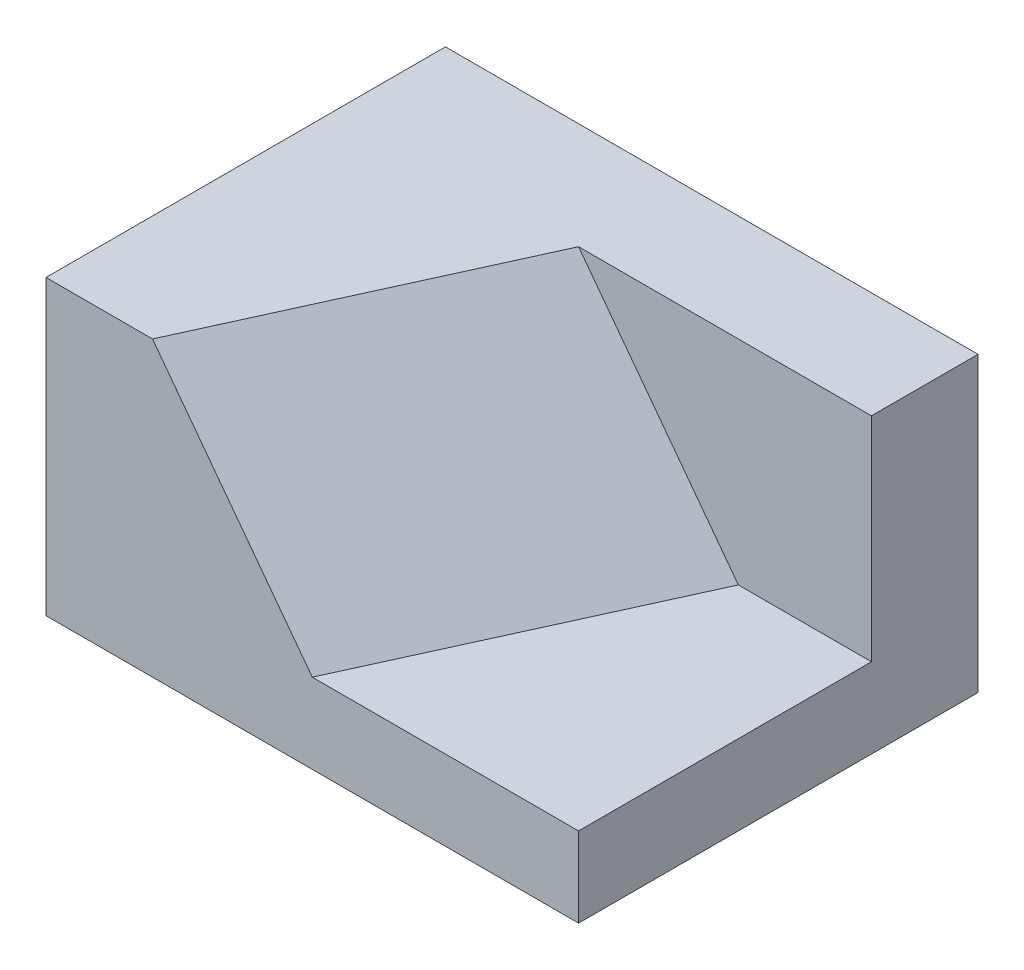
ISO-10303-21;
HEADER;
FILE_DESCRIPTION(('STEP AP214'),'2;1');
FILE_NAME('part.step','',(''),(''),'','','');
FILE_SCHEMA(('AUTOMOTIVE_DESIGN { 1 0 10303 214 1 1 1 1 }'));
ENDSEC;
DATA;
#1=APPLICATION_CONTEXT('core data for automotive mechanical design processes');
#2=APPLICATION_PROTOCOL_DEFINITION('international standard','automotive_design',2000,#1);
#3=PRODUCT_CONTEXT('',#1,'mechanical');
#4=PRODUCT('Part','Part','',(#3));
#5=PRODUCT_RELATED_PRODUCT_CATEGORY('part','',(#4));
#6=PRODUCT_DEFINITION_FORMATION('','',#4);
#7=PRODUCT_DEFINITION_CONTEXT('part definition',#1,'design');
#8=PRODUCT_DEFINITION('design','',#6,#7);
#9=PRODUCT_DEFINITION_SHAPE('','',#8);
#10=(LENGTH_UNIT() NAMED_UNIT(*) SI_UNIT(.MILLI.,.METRE.));
#11=(NAMED_UNIT(*) PLANE_ANGLE_UNIT() SI_UNIT($,.RADIAN.));
#12=(NAMED_UNIT(*) SI_UNIT($,.STERADIAN.) SOLID_ANGLE_UNIT());
#13=UNCERTAINTY_MEASURE_WITH_UNIT(LENGTH_MEASURE(1.E-05),#10,'distance_accuracy_value','');
#14=(GEOMETRIC_REPRESENTATION_CONTEXT(3) GLOBAL_UNCERTAINTY_ASSIGNED_CONTEXT((#13)) GLOBAL_UNIT_ASSIGNED_CONTEXT((#10,
#11,#12)) REPRESENTATION_CONTEXT('',''));
#15=CARTESIAN_POINT('',(0.,0.,0.));
#16=DIRECTION('',(0.,0.,1.));
#17=DIRECTION('',(1.,0.,0.));
#18=AXIS2_PLACEMENT_3D('',#15,#16,#17);
#19=CARTESIAN_POINT('',(100.,0.,0.));
#20=DIRECTION('',(0.,0.,-1.));
#21=DIRECTION('',(-1.,0.,0.));
#22=AXIS2_PLACEMENT_3D('',#19,#20,#21);
#23=PLANE('',#22);
#24=DIRECTION('',(-1.,0.,0.));
#25=VECTOR('',#24,1.);
#26=CARTESIAN_POINT('',(100.,40.,0.));
#27=LINE('',#26,#25);
#28=CARTESIAN_POINT('',(100.,40.,0.));
#29=VERTEX_POINT('',#28);
#30=CARTESIAN_POINT('',(45.,40.,0.));
#31=VERTEX_POINT('',#30);
#32=EDGE_CURVE('E64',#29,#31,#27,.T.);
#33=ORIENTED_EDGE('',*,*,#32,.T.);
#34=DIRECTION('',(0.6,-0.8,0.));
#35=VECTOR('',#34,1.);
#36=CARTESIAN_POINT('',(45.,40.,0.));
#37=LINE('',#36,#35);
#38=CARTESIAN_POINT('',(75.,0.,0.));
#39=VERTEX_POINT('',#38);
#40=EDGE_CURVE('E156',#31,#39,#37,.T.);
#41=ORIENTED_EDGE('',*,*,#40,.T.);
#42=DIRECTION('',(-1.,0.,0.));
#43=VECTOR('',#42,1.);
#44=CARTESIAN_POINT('',(100.,0.,0.));
#45=LINE('',#44,#43);
#46=CARTESIAN_POINT('',(100.,0.,0.));
#47=VERTEX_POINT('',#46);
#48=EDGE_CURVE('E11',#47,#39,#45,.T.);
#49=ORIENTED_EDGE('',*,*,#48,.F.);
#50=DIRECTION('',(0.,-1.,0.));
#51=VECTOR('',#50,1.);
#52=CARTESIAN_POINT('',(100.,0.,0.));
#53=LINE('',#52,#51);
#54=EDGE_CURVE('E137',#29,#47,#53,.T.);
#55=ORIENTED_EDGE('',*,*,#54,.F.);
#56=EDGE_LOOP('',(#33,#41,#49,#55));
#57=FACE_BOUND('',#56,.T.);
#58=ADVANCED_FACE('F41',(#57),#23,.F.);
#59=CARTESIAN_POINT('',(100.,0.,0.));
#60=DIRECTION('',(0.,-1.,0.));
#61=DIRECTION('',(0.,0.,-1.));
#62=AXIS2_PLACEMENT_3D('',#59,#60,#61);
#63=PLANE('',#62);
#64=ORIENTED_EDGE('',*,*,#48,.T.);
#65=DIRECTION('',(-0.413802944301184,0.,0.910366477462605));
#66=VECTOR('',#65,1.);
#67=CARTESIAN_POINT('',(75.,0.,0.));
#68=LINE('',#67,#66);
#69=CARTESIAN_POINT('',(50.,0.,55.));
#70=VERTEX_POINT('',#69);
#71=EDGE_CURVE('E55',#39,#70,#68,.T.);
#72=ORIENTED_EDGE('',*,*,#71,.T.);
#73=DIRECTION('',(-1.,0.,0.));
#74=VECTOR('',#73,1.);
#75=CARTESIAN_POINT('',(100.,0.,55.));
#76=LINE('',#75,#74);
#77=CARTESIAN_POINT('',(100.,0.,55.));
#78=VERTEX_POINT('',#77);
#79=EDGE_CURVE('E48',#78,#70,#76,.T.);
#80=ORIENTED_EDGE('',*,*,#79,.F.);
#81=DIRECTION('',(0.,0.,1.));
#82=VECTOR('',#81,1.);
#83=CARTESIAN_POINT('',(100.,0.,0.));
#84=LINE('',#83,#82);
#85=EDGE_CURVE('E89',#47,#78,#84,.T.);
#86=ORIENTED_EDGE('',*,*,#85,.F.);
#87=EDGE_LOOP('',(#64,#72,#80,#86));
#88=FACE_BOUND('',#87,.T.);
#89=ADVANCED_FACE('F154',(#88),#63,.F.);
#90=CARTESIAN_POINT('',(100.,0.,55.));
#91=DIRECTION('',(0.,0.,-1.));
#92=DIRECTION('',(0.,1.,0.));
#93=AXIS2_PLACEMENT_3D('',#90,#91,#92);
#94=PLANE('',#93);
#95=ORIENTED_EDGE('',*,*,#79,.T.);
#96=DIRECTION('',(-0.6,0.8,0.));
#97=VECTOR('',#96,1.);
#98=CARTESIAN_POINT('',(50.,0.,55.));
#99=LINE('',#98,#97);
#100=CARTESIAN_POINT('',(20.,40.,55.));
#101=VERTEX_POINT('',#100);
#102=EDGE_CURVE('E147',#70,#101,#99,.T.);
#103=ORIENTED_EDGE('',*,*,#102,.T.);
#104=DIRECTION('',(-1.,0.,0.));
#105=VECTOR('',#104,1.);
#106=CARTESIAN_POINT('',(75.,40.,55.));
#107=LINE('',#106,#105);
#108=CARTESIAN_POINT('',(0.,40.,55.));
#109=VERTEX_POINT('',#108);
#110=EDGE_CURVE('E130',#101,#109,#107,.T.);
#111=ORIENTED_EDGE('',*,*,#110,.T.);
#112=DIRECTION('',(0.,-1.,0.));
#113=VECTOR('',#112,1.);
#114=CARTESIAN_POINT('',(0.,0.,55.));
#115=LINE('',#114,#113);
#116=CARTESIAN_POINT('',(0.,-15.,55.));
#117=VERTEX_POINT('',#116);
#118=EDGE_CURVE('E128',#109,#117,#115,.T.);
#119=ORIENTED_EDGE('',*,*,#118,.T.);
#120=DIRECTION('',(-1.,0.,0.));
#121=VECTOR('',#120,1.);
#122=CARTESIAN_POINT('',(100.,-15.,55.));
#123=LINE('',#122,#121);
#124=CARTESIAN_POINT('',(100.,-15.,55.));
#125=VERTEX_POINT('',#124);
#126=EDGE_CURVE('E120',#125,#117,#123,.T.);
#127=ORIENTED_EDGE('',*,*,#126,.F.);
#128=DIRECTION('',(0.,-1.,0.));
#129=VECTOR('',#128,1.);
#130=CARTESIAN_POINT('',(100.,0.,55.));
#131=LINE('',#130,#129);
#132=EDGE_CURVE('E108',#78,#125,#131,.T.);
#133=ORIENTED_EDGE('',*,*,#132,.F.);
#134=EDGE_LOOP('',(#95,#103,#111,#119,#127,#133));
#135=FACE_BOUND('',#134,.T.);
#136=ADVANCED_FACE('F144',(#135),#94,.F.);
#137=CARTESIAN_POINT('',(100.,-15.,0.));
#138=DIRECTION('',(0.,1.,0.));
#139=DIRECTION('',(0.,0.,1.));
#140=AXIS2_PLACEMENT_3D('',#137,#138,#139);
#141=PLANE('',#140);
#142=DIRECTION('',(0.,0.,-1.));
#143=VECTOR('',#142,1.);
#144=CARTESIAN_POINT('',(0.,-15.,0.));
#145=LINE('',#144,#143);
#146=CARTESIAN_POINT('',(0.,-15.,-20.));
#147=VERTEX_POINT('',#146);
#148=EDGE_CURVE('E117',#117,#147,#145,.T.);
#149=ORIENTED_EDGE('',*,*,#148,.T.);
#150=DIRECTION('',(-1.,0.,0.));
#151=VECTOR('',#150,1.);
#152=CARTESIAN_POINT('',(100.,-15.,-20.));
#153=LINE('',#152,#151);
#154=CARTESIAN_POINT('',(100.,-15.,-20.));
#155=VERTEX_POINT('',#154);
#156=EDGE_CURVE('E114',#155,#147,#153,.T.);
#157=ORIENTED_EDGE('',*,*,#156,.F.);
#158=DIRECTION('',(0.,0.,-1.));
#159=VECTOR('',#158,1.);
#160=CARTESIAN_POINT('',(100.,-15.,0.));
#161=LINE('',#160,#159);
#162=EDGE_CURVE('E101',#125,#155,#161,.T.);
#163=ORIENTED_EDGE('',*,*,#162,.F.);
#164=ORIENTED_EDGE('',*,*,#126,.T.);
#165=EDGE_LOOP('',(#149,#157,#163,#164));
#166=FACE_BOUND('',#165,.T.);
#167=ADVANCED_FACE('F115',(#166),#141,.F.);
#168=CARTESIAN_POINT('',(100.,0.,-20.));
#169=DIRECTION('',(0.,0.,-1.));
#170=DIRECTION('',(0.,1.,0.));
#171=AXIS2_PLACEMENT_3D('',#168,#169,#170);
#172=PLANE('',#171);
#173=DIRECTION('',(0.,-1.,0.));
#174=VECTOR('',#173,1.);
#175=CARTESIAN_POINT('',(0.,0.,-20.));
#176=LINE('',#175,#174);
#177=CARTESIAN_POINT('',(0.,40.,-20.));
#178=VERTEX_POINT('',#177);
#179=EDGE_CURVE('E132',#178,#147,#176,.T.);
#180=ORIENTED_EDGE('',*,*,#179,.F.);
#181=DIRECTION('',(-1.,0.,0.));
#182=VECTOR('',#181,1.);
#183=CARTESIAN_POINT('',(100.,40.,-20.));
#184=LINE('',#183,#182);
#185=CARTESIAN_POINT('',(100.,40.,-20.));
#186=VERTEX_POINT('',#185);
#187=EDGE_CURVE('E81',#186,#178,#184,.T.);
#188=ORIENTED_EDGE('',*,*,#187,.F.);
#189=DIRECTION('',(0.,-1.,0.));
#190=VECTOR('',#189,1.);
#191=CARTESIAN_POINT('',(100.,0.,-20.));
#192=LINE('',#191,#190);
#193=EDGE_CURVE('E106',#186,#155,#192,.T.);
#194=ORIENTED_EDGE('',*,*,#193,.T.);
#195=ORIENTED_EDGE('',*,*,#156,.T.);
#196=EDGE_LOOP('',(#180,#188,#194,#195));
#197=FACE_BOUND('',#196,.T.);
#198=ADVANCED_FACE('F122',(#197),#172,.T.);
#199=CARTESIAN_POINT('',(100.,40.,0.));
#200=DIRECTION('',(0.,1.,0.));
#201=DIRECTION('',(0.,0.,1.));
#202=AXIS2_PLACEMENT_3D('',#199,#200,#201);
#203=PLANE('',#202);
#204=DIRECTION('',(0.413802944301184,0.,-0.910366477462605));
#205=VECTOR('',#204,1.);
#206=CARTESIAN_POINT('',(20.,40.,55.));
#207=LINE('',#206,#205);
#208=EDGE_CURVE('E152',#101,#31,#207,.T.);
#209=ORIENTED_EDGE('',*,*,#208,.T.);
#210=ORIENTED_EDGE('',*,*,#32,.F.);
#211=DIRECTION('',(0.,0.,-1.));
#212=VECTOR('',#211,1.);
#213=CARTESIAN_POINT('',(100.,40.,0.));
#214=LINE('',#213,#212);
#215=EDGE_CURVE('E123',#29,#186,#214,.T.);
#216=ORIENTED_EDGE('',*,*,#215,.T.);
#217=ORIENTED_EDGE('',*,*,#187,.T.);
#218=DIRECTION('',(0.,0.,-1.));
#219=VECTOR('',#218,1.);
#220=CARTESIAN_POINT('',(0.,40.,0.));
#221=LINE('',#220,#219);
#222=EDGE_CURVE('E134',#109,#178,#221,.T.);
#223=ORIENTED_EDGE('',*,*,#222,.F.);
#224=ORIENTED_EDGE('',*,*,#110,.F.);
#225=EDGE_LOOP('',(#209,#210,#216,#217,#223,#224));
#226=FACE_BOUND('',#225,.T.);
#227=ADVANCED_FACE('F165',(#226),#203,.T.);
#228=CARTESIAN_POINT('',(100.,0.,0.));
#229=DIRECTION('',(1.,0.,0.));
#230=DIRECTION('',(0.,0.,-1.));
#231=AXIS2_PLACEMENT_3D('',#228,#229,#230);
#232=PLANE('',#231);
#233=ORIENTED_EDGE('',*,*,#54,.T.);
#234=ORIENTED_EDGE('',*,*,#85,.T.);
#235=ORIENTED_EDGE('',*,*,#132,.T.);
#236=ORIENTED_EDGE('',*,*,#162,.T.);
#237=ORIENTED_EDGE('',*,*,#193,.F.);
#238=ORIENTED_EDGE('',*,*,#215,.F.);
#239=EDGE_LOOP('',(#233,#234,#235,#236,#237,#238));
#240=FACE_BOUND('',#239,.T.);
#241=ADVANCED_FACE('F103',(#240),#232,.T.);
#242=CARTESIAN_POINT('',(0.,0.,0.));
#243=DIRECTION('',(1.,0.,0.));
#244=DIRECTION('',(0.,0.,-1.));
#245=AXIS2_PLACEMENT_3D('',#242,#243,#244);
#246=PLANE('',#245);
#247=ORIENTED_EDGE('',*,*,#118,.F.);
#248=ORIENTED_EDGE('',*,*,#222,.T.);
#249=ORIENTED_EDGE('',*,*,#179,.T.);
#250=ORIENTED_EDGE('',*,*,#148,.F.);
#251=EDGE_LOOP('',(#247,#248,#249,#250));
#252=FACE_BOUND('',#251,.T.);
#253=ADVANCED_FACE('F169',(#252),#246,.F.);
#254=CARTESIAN_POINT('',(42.3941605839416,31.7956204379562,19.2700729927007));
#255=DIRECTION('',(-0.75183473879075,-0.563876054093062,-0.341743063086704));
#256=DIRECTION('',(0.6,-0.8,0.));
#257=AXIS2_PLACEMENT_3D('',#254,#255,#256);
#258=PLANE('',#257);
#259=ORIENTED_EDGE('',*,*,#102,.F.);
#260=ORIENTED_EDGE('',*,*,#71,.F.);
#261=ORIENTED_EDGE('',*,*,#40,.F.);
#262=ORIENTED_EDGE('',*,*,#208,.F.);
#263=EDGE_LOOP('',(#259,#260,#261,#262));
#264=FACE_BOUND('',#263,.T.);
#265=ADVANCED_FACE('F151',(#264),#258,.F.);
#266=CLOSED_SHELL('',(#58,#89,#136,#167,#198,#227,#241,#253,#265));
#267=MANIFOLD_SOLID_BREP('B2',#266);
#268=ADVANCED_BREP_SHAPE_REPRESENTATION('',(#18,#267),#14);
#269=SHAPE_DEFINITION_REPRESENTATION(#9,#268);
ENDSEC;
END-ISO-10303-21;
